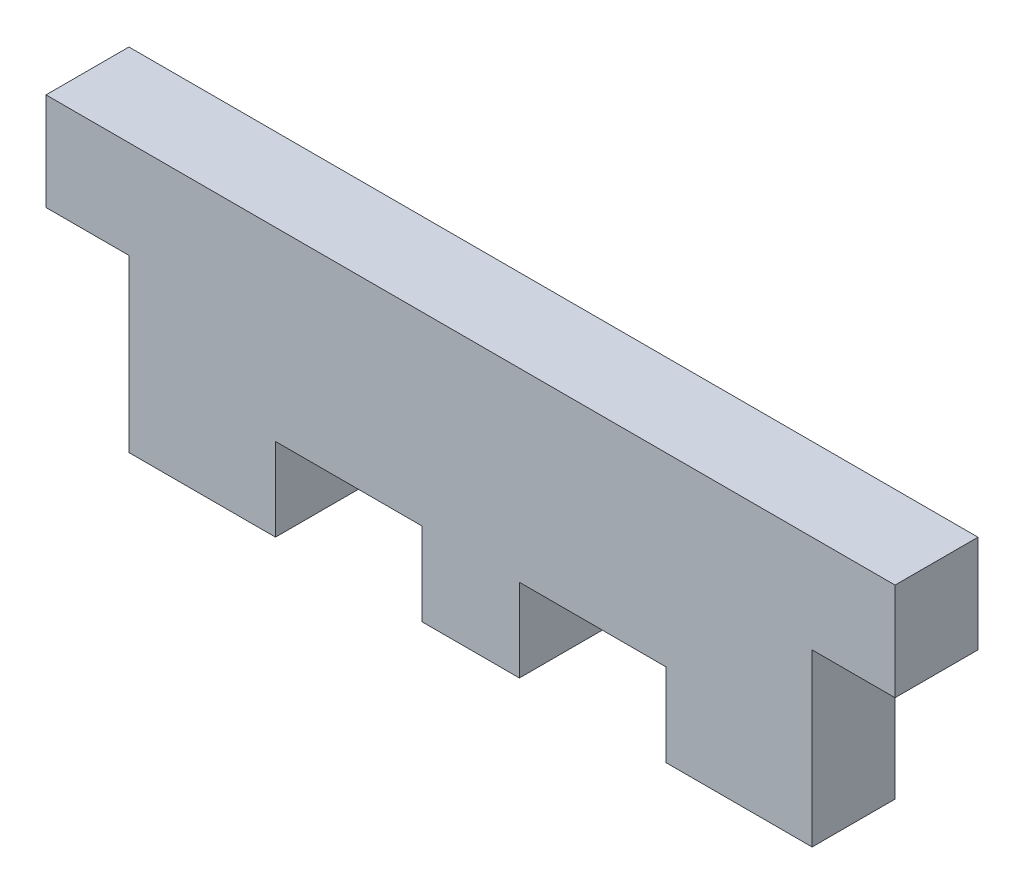
ISO-10303-21;
HEADER;
FILE_DESCRIPTION(('STEP AP214'),'2;1');
FILE_NAME('part.step','',(''),(''),'','','');
FILE_SCHEMA(('AUTOMOTIVE_DESIGN { 1 0 10303 214 1 1 1 1 }'));
ENDSEC;
DATA;
#1=APPLICATION_CONTEXT('core data for automotive mechanical design processes');
#2=APPLICATION_PROTOCOL_DEFINITION('international standard','automotive_design',2000,#1);
#3=PRODUCT_CONTEXT('',#1,'mechanical');
#4=PRODUCT('Part','Part','',(#3));
#5=PRODUCT_RELATED_PRODUCT_CATEGORY('part','',(#4));
#6=PRODUCT_DEFINITION_FORMATION('','',#4);
#7=PRODUCT_DEFINITION_CONTEXT('part definition',#1,'design');
#8=PRODUCT_DEFINITION('design','',#6,#7);
#9=PRODUCT_DEFINITION_SHAPE('','',#8);
#10=(LENGTH_UNIT() NAMED_UNIT(*) SI_UNIT(.MILLI.,.METRE.));
#11=(NAMED_UNIT(*) PLANE_ANGLE_UNIT() SI_UNIT($,.RADIAN.));
#12=(NAMED_UNIT(*) SI_UNIT($,.STERADIAN.) SOLID_ANGLE_UNIT());
#13=UNCERTAINTY_MEASURE_WITH_UNIT(LENGTH_MEASURE(1.E-05),#10,'distance_accuracy_value','');
#14=(GEOMETRIC_REPRESENTATION_CONTEXT(3) GLOBAL_UNCERTAINTY_ASSIGNED_CONTEXT((#13)) GLOBAL_UNIT_ASSIGNED_CONTEXT((#10,
#11,#12)) REPRESENTATION_CONTEXT('',''));
#15=CARTESIAN_POINT('',(0.,0.,0.));
#16=DIRECTION('',(0.,0.,1.));
#17=DIRECTION('',(1.,0.,0.));
#18=AXIS2_PLACEMENT_3D('',#15,#16,#17);
#19=CARTESIAN_POINT('',(-70.0392334774524,27.5,17.));
#20=DIRECTION('',(0.,-1.,0.));
#21=DIRECTION('',(0.,0.,-1.));
#22=AXIS2_PLACEMENT_3D('',#19,#20,#21);
#23=PLANE('',#22);
#24=DIRECTION('',(-1.,0.,0.));
#25=VECTOR('',#24,1.);
#26=CARTESIAN_POINT('',(-70.0392334774524,27.5,0.));
#27=LINE('',#26,#25);
#28=CARTESIAN_POINT('',(87.,27.5,0.));
#29=VERTEX_POINT('',#28);
#30=CARTESIAN_POINT('',(-87.0392334774524,27.5,0.));
#31=VERTEX_POINT('',#30);
#32=EDGE_CURVE('E112',#29,#31,#27,.T.);
#33=ORIENTED_EDGE('',*,*,#32,.T.);
#34=DIRECTION('',(0.,0.,-1.));
#35=VECTOR('',#34,1.);
#36=CARTESIAN_POINT('',(-87.0392334774524,27.5,17.));
#37=LINE('',#36,#35);
#38=CARTESIAN_POINT('',(-87.0392334774524,27.5,17.));
#39=VERTEX_POINT('',#38);
#40=EDGE_CURVE('E11',#39,#31,#37,.T.);
#41=ORIENTED_EDGE('',*,*,#40,.F.);
#42=DIRECTION('',(-1.,0.,0.));
#43=VECTOR('',#42,1.);
#44=CARTESIAN_POINT('',(70.,27.5,17.));
#45=LINE('',#44,#43);
#46=CARTESIAN_POINT('',(87.,27.5,17.));
#47=VERTEX_POINT('',#46);
#48=EDGE_CURVE('E118',#47,#39,#45,.T.);
#49=ORIENTED_EDGE('',*,*,#48,.F.);
#50=DIRECTION('',(0.,0.,-1.));
#51=VECTOR('',#50,1.);
#52=CARTESIAN_POINT('',(87.,27.5,17.));
#53=LINE('',#52,#51);
#54=EDGE_CURVE('E178',#47,#29,#53,.T.);
#55=ORIENTED_EDGE('',*,*,#54,.T.);
#56=EDGE_LOOP('',(#33,#41,#49,#55));
#57=FACE_BOUND('',#56,.T.);
#58=ADVANCED_FACE('F33',(#57),#23,.F.);
#59=CARTESIAN_POINT('',(-87.0392334774524,27.5,17.));
#60=DIRECTION('',(1.,0.,0.));
#61=DIRECTION('',(0.,0.,-1.));
#62=AXIS2_PLACEMENT_3D('',#59,#60,#61);
#63=PLANE('',#62);
#64=DIRECTION('',(0.,-1.,0.));
#65=VECTOR('',#64,1.);
#66=CARTESIAN_POINT('',(-87.0392334774524,27.5,0.));
#67=LINE('',#66,#65);
#68=CARTESIAN_POINT('',(-87.0392334774524,7.49999999999999,0.));
#69=VERTEX_POINT('',#68);
#70=EDGE_CURVE('E183',#31,#69,#67,.T.);
#71=ORIENTED_EDGE('',*,*,#70,.T.);
#72=DIRECTION('',(0.,0.,-1.));
#73=VECTOR('',#72,1.);
#74=CARTESIAN_POINT('',(-87.0392334774524,7.49999999999999,17.));
#75=LINE('',#74,#73);
#76=CARTESIAN_POINT('',(-87.0392334774524,7.49999999999999,17.));
#77=VERTEX_POINT('',#76);
#78=EDGE_CURVE('E41',#77,#69,#75,.T.);
#79=ORIENTED_EDGE('',*,*,#78,.F.);
#80=DIRECTION('',(0.,-1.,0.));
#81=VECTOR('',#80,1.);
#82=CARTESIAN_POINT('',(-87.0392334774524,27.5,17.));
#83=LINE('',#82,#81);
#84=EDGE_CURVE('E308',#39,#77,#83,.T.);
#85=ORIENTED_EDGE('',*,*,#84,.F.);
#86=ORIENTED_EDGE('',*,*,#40,.T.);
#87=EDGE_LOOP('',(#71,#79,#85,#86));
#88=FACE_BOUND('',#87,.T.);
#89=ADVANCED_FACE('F311',(#88),#63,.F.);
#90=CARTESIAN_POINT('',(-87.0392334774524,7.49999999999999,17.));
#91=DIRECTION('',(0.,1.,0.));
#92=DIRECTION('',(0.,0.,1.));
#93=AXIS2_PLACEMENT_3D('',#90,#91,#92);
#94=PLANE('',#93);
#95=DIRECTION('',(1.,0.,0.));
#96=VECTOR('',#95,1.);
#97=CARTESIAN_POINT('',(-87.0392334774524,7.49999999999999,0.));
#98=LINE('',#97,#96);
#99=CARTESIAN_POINT('',(-70.0392334774524,7.49999999999999,0.));
#100=VERTEX_POINT('',#99);
#101=EDGE_CURVE('E185',#69,#100,#98,.T.);
#102=ORIENTED_EDGE('',*,*,#101,.T.);
#103=DIRECTION('',(0.,0.,-1.));
#104=VECTOR('',#103,1.);
#105=CARTESIAN_POINT('',(-70.0392334774524,7.49999999999999,17.));
#106=LINE('',#105,#104);
#107=CARTESIAN_POINT('',(-70.0392334774524,7.49999999999999,17.));
#108=VERTEX_POINT('',#107);
#109=EDGE_CURVE('E248',#108,#100,#106,.T.);
#110=ORIENTED_EDGE('',*,*,#109,.F.);
#111=DIRECTION('',(1.,0.,0.));
#112=VECTOR('',#111,1.);
#113=CARTESIAN_POINT('',(-87.0392334774524,7.49999999999999,17.));
#114=LINE('',#113,#112);
#115=EDGE_CURVE('E257',#77,#108,#114,.T.);
#116=ORIENTED_EDGE('',*,*,#115,.F.);
#117=ORIENTED_EDGE('',*,*,#78,.T.);
#118=EDGE_LOOP('',(#102,#110,#116,#117));
#119=FACE_BOUND('',#118,.T.);
#120=ADVANCED_FACE('F255',(#119),#94,.F.);
#121=CARTESIAN_POINT('',(-70.0392334774524,7.49999999999999,17.));
#122=DIRECTION('',(1.,0.,0.));
#123=DIRECTION('',(0.,0.,-1.));
#124=AXIS2_PLACEMENT_3D('',#121,#122,#123);
#125=PLANE('',#124);
#126=DIRECTION('',(0.,-1.,0.));
#127=VECTOR('',#126,1.);
#128=CARTESIAN_POINT('',(-70.0392334774524,7.49999999999999,0.));
#129=LINE('',#128,#127);
#130=CARTESIAN_POINT('',(-70.0392334774524,-7.50000000000001,0.));
#131=VERTEX_POINT('',#130);
#132=EDGE_CURVE('E187',#100,#131,#129,.T.);
#133=ORIENTED_EDGE('',*,*,#132,.T.);
#134=DIRECTION('',(0.,0.,-1.));
#135=VECTOR('',#134,1.);
#136=CARTESIAN_POINT('',(-70.0392334774524,-7.50000000000001,17.));
#137=LINE('',#136,#135);
#138=CARTESIAN_POINT('',(-70.0392334774524,-7.50000000000001,17.));
#139=VERTEX_POINT('',#138);
#140=EDGE_CURVE('E245',#139,#131,#137,.T.);
#141=ORIENTED_EDGE('',*,*,#140,.F.);
#142=DIRECTION('',(0.,-1.,0.));
#143=VECTOR('',#142,1.);
#144=CARTESIAN_POINT('',(-70.0392334774524,7.49999999999999,17.));
#145=LINE('',#144,#143);
#146=EDGE_CURVE('E275',#108,#139,#145,.T.);
#147=ORIENTED_EDGE('',*,*,#146,.F.);
#148=ORIENTED_EDGE('',*,*,#109,.T.);
#149=EDGE_LOOP('',(#133,#141,#147,#148));
#150=FACE_BOUND('',#149,.T.);
#151=ADVANCED_FACE('F266',(#150),#125,.F.);
#152=CARTESIAN_POINT('',(-70.0392334774524,-7.50000000000001,17.));
#153=DIRECTION('',(0.999998075923362,0.00196167009820758,0.));
#154=DIRECTION('',(-0.00196167009820758,0.999998075923362,0.));
#155=AXIS2_PLACEMENT_3D('',#152,#153,#154);
#156=PLANE('',#155);
#157=DIRECTION('',(0.00196167009820758,-0.999998075923362,0.));
#158=VECTOR('',#157,1.);
#159=CARTESIAN_POINT('',(-70.0392334774524,-7.50000000000001,0.));
#160=LINE('',#159,#158);
#161=CARTESIAN_POINT('',(-70.,-27.5,0.));
#162=VERTEX_POINT('',#161);
#163=EDGE_CURVE('E189',#131,#162,#160,.T.);
#164=ORIENTED_EDGE('',*,*,#163,.T.);
#165=DIRECTION('',(0.,0.,-1.));
#166=VECTOR('',#165,1.);
#167=CARTESIAN_POINT('',(-70.,-27.5,17.));
#168=LINE('',#167,#166);
#169=CARTESIAN_POINT('',(-70.,-27.5,17.));
#170=VERTEX_POINT('',#169);
#171=EDGE_CURVE('E242',#170,#162,#168,.T.);
#172=ORIENTED_EDGE('',*,*,#171,.F.);
#173=DIRECTION('',(0.00196167009820758,-0.999998075923362,0.));
#174=VECTOR('',#173,1.);
#175=CARTESIAN_POINT('',(-70.0392334774524,-7.50000000000001,17.));
#176=LINE('',#175,#174);
#177=EDGE_CURVE('E272',#139,#170,#176,.T.);
#178=ORIENTED_EDGE('',*,*,#177,.F.);
#179=ORIENTED_EDGE('',*,*,#140,.T.);
#180=EDGE_LOOP('',(#164,#172,#178,#179));
#181=FACE_BOUND('',#180,.T.);
#182=ADVANCED_FACE('F270',(#181),#156,.F.);
#183=CARTESIAN_POINT('',(-70.,-27.5,17.));
#184=DIRECTION('',(0.,1.,0.));
#185=DIRECTION('',(0.,0.,1.));
#186=AXIS2_PLACEMENT_3D('',#183,#184,#185);
#187=PLANE('',#186);
#188=DIRECTION('',(1.,0.,0.));
#189=VECTOR('',#188,1.);
#190=CARTESIAN_POINT('',(-70.,-27.5,0.));
#191=LINE('',#190,#189);
#192=CARTESIAN_POINT('',(-40.,-27.5,0.));
#193=VERTEX_POINT('',#192);
#194=EDGE_CURVE('E191',#162,#193,#191,.T.);
#195=ORIENTED_EDGE('',*,*,#194,.T.);
#196=DIRECTION('',(0.,0.,-1.));
#197=VECTOR('',#196,1.);
#198=CARTESIAN_POINT('',(-40.,-27.5,17.));
#199=LINE('',#198,#197);
#200=CARTESIAN_POINT('',(-40.,-27.5,17.));
#201=VERTEX_POINT('',#200);
#202=EDGE_CURVE('E239',#201,#193,#199,.T.);
#203=ORIENTED_EDGE('',*,*,#202,.F.);
#204=DIRECTION('',(1.,0.,0.));
#205=VECTOR('',#204,1.);
#206=CARTESIAN_POINT('',(-70.,-27.5,17.));
#207=LINE('',#206,#205);
#208=EDGE_CURVE('E274',#170,#201,#207,.T.);
#209=ORIENTED_EDGE('',*,*,#208,.F.);
#210=ORIENTED_EDGE('',*,*,#171,.T.);
#211=EDGE_LOOP('',(#195,#203,#209,#210));
#212=FACE_BOUND('',#211,.T.);
#213=ADVANCED_FACE('F323',(#212),#187,.F.);
#214=CARTESIAN_POINT('',(-40.,-10.5,17.));
#215=DIRECTION('',(-1.,0.,0.));
#216=DIRECTION('',(0.,0.,1.));
#217=AXIS2_PLACEMENT_3D('',#214,#215,#216);
#218=PLANE('',#217);
#219=DIRECTION('',(0.,1.,0.));
#220=VECTOR('',#219,1.);
#221=CARTESIAN_POINT('',(-40.,-10.5,0.));
#222=LINE('',#221,#220);
#223=CARTESIAN_POINT('',(-40.,-10.5,0.));
#224=VERTEX_POINT('',#223);
#225=EDGE_CURVE('E193',#193,#224,#222,.T.);
#226=ORIENTED_EDGE('',*,*,#225,.T.);
#227=DIRECTION('',(0.,0.,-1.));
#228=VECTOR('',#227,1.);
#229=CARTESIAN_POINT('',(-40.,-10.5,17.));
#230=LINE('',#229,#228);
#231=CARTESIAN_POINT('',(-40.,-10.5,17.));
#232=VERTEX_POINT('',#231);
#233=EDGE_CURVE('E236',#232,#224,#230,.T.);
#234=ORIENTED_EDGE('',*,*,#233,.F.);
#235=DIRECTION('',(0.,1.,0.));
#236=VECTOR('',#235,1.);
#237=CARTESIAN_POINT('',(-40.,-10.5,17.));
#238=LINE('',#237,#236);
#239=EDGE_CURVE('E277',#201,#232,#238,.T.);
#240=ORIENTED_EDGE('',*,*,#239,.F.);
#241=ORIENTED_EDGE('',*,*,#202,.T.);
#242=EDGE_LOOP('',(#226,#234,#240,#241));
#243=FACE_BOUND('',#242,.T.);
#244=ADVANCED_FACE('F326',(#243),#218,.F.);
#245=CARTESIAN_POINT('',(-40.,-10.5,17.));
#246=DIRECTION('',(0.,1.,0.));
#247=DIRECTION('',(0.,0.,1.));
#248=AXIS2_PLACEMENT_3D('',#245,#246,#247);
#249=PLANE('',#248);
#250=DIRECTION('',(1.,0.,0.));
#251=VECTOR('',#250,1.);
#252=CARTESIAN_POINT('',(-40.,-10.5,0.));
#253=LINE('',#252,#251);
#254=CARTESIAN_POINT('',(-10.,-10.5,0.));
#255=VERTEX_POINT('',#254);
#256=EDGE_CURVE('E195',#224,#255,#253,.T.);
#257=ORIENTED_EDGE('',*,*,#256,.T.);
#258=DIRECTION('',(0.,0.,-1.));
#259=VECTOR('',#258,1.);
#260=CARTESIAN_POINT('',(-10.,-10.5,17.));
#261=LINE('',#260,#259);
#262=CARTESIAN_POINT('',(-10.,-10.5,17.));
#263=VERTEX_POINT('',#262);
#264=EDGE_CURVE('E233',#263,#255,#261,.T.);
#265=ORIENTED_EDGE('',*,*,#264,.F.);
#266=DIRECTION('',(1.,0.,0.));
#267=VECTOR('',#266,1.);
#268=CARTESIAN_POINT('',(-40.,-10.5,17.));
#269=LINE('',#268,#267);
#270=EDGE_CURVE('E283',#232,#263,#269,.T.);
#271=ORIENTED_EDGE('',*,*,#270,.F.);
#272=ORIENTED_EDGE('',*,*,#233,.T.);
#273=EDGE_LOOP('',(#257,#265,#271,#272));
#274=FACE_BOUND('',#273,.T.);
#275=ADVANCED_FACE('F330',(#274),#249,.F.);
#276=CARTESIAN_POINT('',(-10.,-10.5,17.));
#277=DIRECTION('',(1.,0.,0.));
#278=DIRECTION('',(0.,0.,-1.));
#279=AXIS2_PLACEMENT_3D('',#276,#277,#278);
#280=PLANE('',#279);
#281=DIRECTION('',(0.,-1.,0.));
#282=VECTOR('',#281,1.);
#283=CARTESIAN_POINT('',(-10.,-10.5,0.));
#284=LINE('',#283,#282);
#285=CARTESIAN_POINT('',(-10.,-27.5,0.));
#286=VERTEX_POINT('',#285);
#287=EDGE_CURVE('E197',#255,#286,#284,.T.);
#288=ORIENTED_EDGE('',*,*,#287,.T.);
#289=DIRECTION('',(0.,0.,-1.));
#290=VECTOR('',#289,1.);
#291=CARTESIAN_POINT('',(-10.,-27.5,17.));
#292=LINE('',#291,#290);
#293=CARTESIAN_POINT('',(-10.,-27.5,17.));
#294=VERTEX_POINT('',#293);
#295=EDGE_CURVE('E230',#294,#286,#292,.T.);
#296=ORIENTED_EDGE('',*,*,#295,.F.);
#297=DIRECTION('',(0.,-1.,0.));
#298=VECTOR('',#297,1.);
#299=CARTESIAN_POINT('',(-10.,-10.5,17.));
#300=LINE('',#299,#298);
#301=EDGE_CURVE('E285',#263,#294,#300,.T.);
#302=ORIENTED_EDGE('',*,*,#301,.F.);
#303=ORIENTED_EDGE('',*,*,#264,.T.);
#304=EDGE_LOOP('',(#288,#296,#302,#303));
#305=FACE_BOUND('',#304,.T.);
#306=ADVANCED_FACE('F334',(#305),#280,.F.);
#307=CARTESIAN_POINT('',(-10.,-27.5,17.));
#308=DIRECTION('',(0.,1.,0.));
#309=DIRECTION('',(0.,0.,1.));
#310=AXIS2_PLACEMENT_3D('',#307,#308,#309);
#311=PLANE('',#310);
#312=DIRECTION('',(1.,0.,0.));
#313=VECTOR('',#312,1.);
#314=CARTESIAN_POINT('',(-10.,-27.5,0.));
#315=LINE('',#314,#313);
#316=CARTESIAN_POINT('',(9.99999999999999,-27.5,0.));
#317=VERTEX_POINT('',#316);
#318=EDGE_CURVE('E199',#286,#317,#315,.T.);
#319=ORIENTED_EDGE('',*,*,#318,.T.);
#320=DIRECTION('',(0.,0.,-1.));
#321=VECTOR('',#320,1.);
#322=CARTESIAN_POINT('',(9.99999999999999,-27.5,17.));
#323=LINE('',#322,#321);
#324=CARTESIAN_POINT('',(9.99999999999999,-27.5,17.));
#325=VERTEX_POINT('',#324);
#326=EDGE_CURVE('E227',#325,#317,#323,.T.);
#327=ORIENTED_EDGE('',*,*,#326,.F.);
#328=DIRECTION('',(1.,0.,0.));
#329=VECTOR('',#328,1.);
#330=CARTESIAN_POINT('',(-10.,-27.5,17.));
#331=LINE('',#330,#329);
#332=EDGE_CURVE('E287',#294,#325,#331,.T.);
#333=ORIENTED_EDGE('',*,*,#332,.F.);
#334=ORIENTED_EDGE('',*,*,#295,.T.);
#335=EDGE_LOOP('',(#319,#327,#333,#334));
#336=FACE_BOUND('',#335,.T.);
#337=ADVANCED_FACE('F338',(#336),#311,.F.);
#338=CARTESIAN_POINT('',(9.99999999999999,-10.5,17.));
#339=DIRECTION('',(-1.,0.,0.));
#340=DIRECTION('',(0.,-1.,0.));
#341=AXIS2_PLACEMENT_3D('',#338,#339,#340);
#342=PLANE('',#341);
#343=DIRECTION('',(0.,1.,0.));
#344=VECTOR('',#343,1.);
#345=CARTESIAN_POINT('',(9.99999999999999,-10.5,0.));
#346=LINE('',#345,#344);
#347=CARTESIAN_POINT('',(9.99999999999999,-10.5,0.));
#348=VERTEX_POINT('',#347);
#349=EDGE_CURVE('E201',#317,#348,#346,.T.);
#350=ORIENTED_EDGE('',*,*,#349,.T.);
#351=DIRECTION('',(0.,0.,-1.));
#352=VECTOR('',#351,1.);
#353=CARTESIAN_POINT('',(9.99999999999999,-10.5,17.));
#354=LINE('',#353,#352);
#355=CARTESIAN_POINT('',(9.99999999999999,-10.5,17.));
#356=VERTEX_POINT('',#355);
#357=EDGE_CURVE('E224',#356,#348,#354,.T.);
#358=ORIENTED_EDGE('',*,*,#357,.F.);
#359=DIRECTION('',(0.,1.,0.));
#360=VECTOR('',#359,1.);
#361=CARTESIAN_POINT('',(9.99999999999999,-10.5,17.));
#362=LINE('',#361,#360);
#363=EDGE_CURVE('E289',#325,#356,#362,.T.);
#364=ORIENTED_EDGE('',*,*,#363,.F.);
#365=ORIENTED_EDGE('',*,*,#326,.T.);
#366=EDGE_LOOP('',(#350,#358,#364,#365));
#367=FACE_BOUND('',#366,.T.);
#368=ADVANCED_FACE('F342',(#367),#342,.F.);
#369=CARTESIAN_POINT('',(9.99999999999999,-10.5,17.));
#370=DIRECTION('',(0.,1.,0.));
#371=DIRECTION('',(0.,0.,1.));
#372=AXIS2_PLACEMENT_3D('',#369,#370,#371);
#373=PLANE('',#372);
#374=DIRECTION('',(1.,0.,0.));
#375=VECTOR('',#374,1.);
#376=CARTESIAN_POINT('',(9.99999999999999,-10.5,0.));
#377=LINE('',#376,#375);
#378=CARTESIAN_POINT('',(40.,-10.5,0.));
#379=VERTEX_POINT('',#378);
#380=EDGE_CURVE('E203',#348,#379,#377,.T.);
#381=ORIENTED_EDGE('',*,*,#380,.T.);
#382=DIRECTION('',(0.,0.,-1.));
#383=VECTOR('',#382,1.);
#384=CARTESIAN_POINT('',(40.,-10.5,17.));
#385=LINE('',#384,#383);
#386=CARTESIAN_POINT('',(40.,-10.5,17.));
#387=VERTEX_POINT('',#386);
#388=EDGE_CURVE('E221',#387,#379,#385,.T.);
#389=ORIENTED_EDGE('',*,*,#388,.F.);
#390=DIRECTION('',(1.,0.,0.));
#391=VECTOR('',#390,1.);
#392=CARTESIAN_POINT('',(9.99999999999999,-10.5,17.));
#393=LINE('',#392,#391);
#394=EDGE_CURVE('E291',#356,#387,#393,.T.);
#395=ORIENTED_EDGE('',*,*,#394,.F.);
#396=ORIENTED_EDGE('',*,*,#357,.T.);
#397=EDGE_LOOP('',(#381,#389,#395,#396));
#398=FACE_BOUND('',#397,.T.);
#399=ADVANCED_FACE('F346',(#398),#373,.F.);
#400=CARTESIAN_POINT('',(40.,-10.5,17.));
#401=DIRECTION('',(1.,0.,0.));
#402=DIRECTION('',(0.,0.,-1.));
#403=AXIS2_PLACEMENT_3D('',#400,#401,#402);
#404=PLANE('',#403);
#405=DIRECTION('',(0.,-1.,0.));
#406=VECTOR('',#405,1.);
#407=CARTESIAN_POINT('',(40.,-10.5,0.));
#408=LINE('',#407,#406);
#409=CARTESIAN_POINT('',(40.,-27.5,0.));
#410=VERTEX_POINT('',#409);
#411=EDGE_CURVE('E205',#379,#410,#408,.T.);
#412=ORIENTED_EDGE('',*,*,#411,.T.);
#413=DIRECTION('',(0.,0.,-1.));
#414=VECTOR('',#413,1.);
#415=CARTESIAN_POINT('',(40.,-27.5,17.));
#416=LINE('',#415,#414);
#417=CARTESIAN_POINT('',(40.,-27.5,17.));
#418=VERTEX_POINT('',#417);
#419=EDGE_CURVE('E218',#418,#410,#416,.T.);
#420=ORIENTED_EDGE('',*,*,#419,.F.);
#421=DIRECTION('',(0.,-1.,0.));
#422=VECTOR('',#421,1.);
#423=CARTESIAN_POINT('',(40.,-10.5,17.));
#424=LINE('',#423,#422);
#425=EDGE_CURVE('E293',#387,#418,#424,.T.);
#426=ORIENTED_EDGE('',*,*,#425,.F.);
#427=ORIENTED_EDGE('',*,*,#388,.T.);
#428=EDGE_LOOP('',(#412,#420,#426,#427));
#429=FACE_BOUND('',#428,.T.);
#430=ADVANCED_FACE('F299',(#429),#404,.F.);
#431=CARTESIAN_POINT('',(40.,-27.5,17.));
#432=DIRECTION('',(0.,1.,0.));
#433=DIRECTION('',(0.,0.,1.));
#434=AXIS2_PLACEMENT_3D('',#431,#432,#433);
#435=PLANE('',#434);
#436=DIRECTION('',(1.,0.,0.));
#437=VECTOR('',#436,1.);
#438=CARTESIAN_POINT('',(40.,-27.5,0.));
#439=LINE('',#438,#437);
#440=CARTESIAN_POINT('',(70.,-27.5,0.));
#441=VERTEX_POINT('',#440);
#442=EDGE_CURVE('E207',#410,#441,#439,.T.);
#443=ORIENTED_EDGE('',*,*,#442,.T.);
#444=DIRECTION('',(0.,0.,-1.));
#445=VECTOR('',#444,1.);
#446=CARTESIAN_POINT('',(70.,-27.5,17.));
#447=LINE('',#446,#445);
#448=CARTESIAN_POINT('',(70.,-27.5,17.));
#449=VERTEX_POINT('',#448);
#450=EDGE_CURVE('E173',#449,#441,#447,.T.);
#451=ORIENTED_EDGE('',*,*,#450,.F.);
#452=DIRECTION('',(1.,0.,0.));
#453=VECTOR('',#452,1.);
#454=CARTESIAN_POINT('',(40.,-27.5,17.));
#455=LINE('',#454,#453);
#456=EDGE_CURVE('E165',#418,#449,#455,.T.);
#457=ORIENTED_EDGE('',*,*,#456,.F.);
#458=ORIENTED_EDGE('',*,*,#419,.T.);
#459=EDGE_LOOP('',(#443,#451,#457,#458));
#460=FACE_BOUND('',#459,.T.);
#461=ADVANCED_FACE('F303',(#460),#435,.F.);
#462=CARTESIAN_POINT('',(70.,7.49999999999999,17.));
#463=DIRECTION('',(-1.,0.,0.));
#464=DIRECTION('',(0.,0.,1.));
#465=AXIS2_PLACEMENT_3D('',#462,#463,#464);
#466=PLANE('',#465);
#467=DIRECTION('',(0.,1.,0.));
#468=VECTOR('',#467,1.);
#469=CARTESIAN_POINT('',(70.,7.49999999999999,0.));
#470=LINE('',#469,#468);
#471=CARTESIAN_POINT('',(70.,7.49999999999999,0.));
#472=VERTEX_POINT('',#471);
#473=EDGE_CURVE('E172',#441,#472,#470,.T.);
#474=ORIENTED_EDGE('',*,*,#473,.T.);
#475=DIRECTION('',(0.,0.,-1.));
#476=VECTOR('',#475,1.);
#477=CARTESIAN_POINT('',(70.,7.49999999999999,17.));
#478=LINE('',#477,#476);
#479=CARTESIAN_POINT('',(70.,7.49999999999999,17.));
#480=VERTEX_POINT('',#479);
#481=EDGE_CURVE('E170',#480,#472,#478,.T.);
#482=ORIENTED_EDGE('',*,*,#481,.F.);
#483=DIRECTION('',(0.,1.,0.));
#484=VECTOR('',#483,1.);
#485=CARTESIAN_POINT('',(70.,-7.50000000000001,17.));
#486=LINE('',#485,#484);
#487=EDGE_CURVE('E159',#449,#480,#486,.T.);
#488=ORIENTED_EDGE('',*,*,#487,.F.);
#489=ORIENTED_EDGE('',*,*,#450,.T.);
#490=EDGE_LOOP('',(#474,#482,#488,#489));
#491=FACE_BOUND('',#490,.T.);
#492=ADVANCED_FACE('F171',(#491),#466,.F.);
#493=CARTESIAN_POINT('',(87.,7.49999999999999,17.));
#494=DIRECTION('',(0.,1.,0.));
#495=DIRECTION('',(0.,0.,1.));
#496=AXIS2_PLACEMENT_3D('',#493,#494,#495);
#497=PLANE('',#496);
#498=DIRECTION('',(1.,0.,0.));
#499=VECTOR('',#498,1.);
#500=CARTESIAN_POINT('',(87.,7.49999999999999,0.));
#501=LINE('',#500,#499);
#502=CARTESIAN_POINT('',(87.,7.49999999999999,0.));
#503=VERTEX_POINT('',#502);
#504=EDGE_CURVE('E105',#472,#503,#501,.T.);
#505=ORIENTED_EDGE('',*,*,#504,.T.);
#506=DIRECTION('',(0.,0.,-1.));
#507=VECTOR('',#506,1.);
#508=CARTESIAN_POINT('',(87.,7.49999999999999,17.));
#509=LINE('',#508,#507);
#510=CARTESIAN_POINT('',(87.,7.49999999999999,17.));
#511=VERTEX_POINT('',#510);
#512=EDGE_CURVE('E174',#511,#503,#509,.T.);
#513=ORIENTED_EDGE('',*,*,#512,.F.);
#514=DIRECTION('',(1.,0.,0.));
#515=VECTOR('',#514,1.);
#516=CARTESIAN_POINT('',(87.,7.49999999999999,17.));
#517=LINE('',#516,#515);
#518=EDGE_CURVE('E163',#480,#511,#517,.T.);
#519=ORIENTED_EDGE('',*,*,#518,.F.);
#520=ORIENTED_EDGE('',*,*,#481,.T.);
#521=EDGE_LOOP('',(#505,#513,#519,#520));
#522=FACE_BOUND('',#521,.T.);
#523=ADVANCED_FACE('F176',(#522),#497,.F.);
#524=CARTESIAN_POINT('',(87.,27.5,17.));
#525=DIRECTION('',(-1.,0.,0.));
#526=DIRECTION('',(0.,0.,1.));
#527=AXIS2_PLACEMENT_3D('',#524,#525,#526);
#528=PLANE('',#527);
#529=DIRECTION('',(0.,1.,0.));
#530=VECTOR('',#529,1.);
#531=CARTESIAN_POINT('',(87.,27.5,0.));
#532=LINE('',#531,#530);
#533=EDGE_CURVE('E212',#503,#29,#532,.T.);
#534=ORIENTED_EDGE('',*,*,#533,.T.);
#535=ORIENTED_EDGE('',*,*,#54,.F.);
#536=DIRECTION('',(0.,1.,0.));
#537=VECTOR('',#536,1.);
#538=CARTESIAN_POINT('',(87.,27.5,17.));
#539=LINE('',#538,#537);
#540=EDGE_CURVE('E49',#511,#47,#539,.T.);
#541=ORIENTED_EDGE('',*,*,#540,.F.);
#542=ORIENTED_EDGE('',*,*,#512,.T.);
#543=EDGE_LOOP('',(#534,#535,#541,#542));
#544=FACE_BOUND('',#543,.T.);
#545=ADVANCED_FACE('F306',(#544),#528,.F.);
#546=CARTESIAN_POINT('',(0.,0.,17.));
#547=DIRECTION('',(0.,0.,-1.));
#548=DIRECTION('',(-1.,0.,0.));
#549=AXIS2_PLACEMENT_3D('',#546,#547,#548);
#550=PLANE('',#549);
#551=ORIENTED_EDGE('',*,*,#48,.T.);
#552=ORIENTED_EDGE('',*,*,#84,.T.);
#553=ORIENTED_EDGE('',*,*,#115,.T.);
#554=ORIENTED_EDGE('',*,*,#146,.T.);
#555=ORIENTED_EDGE('',*,*,#177,.T.);
#556=ORIENTED_EDGE('',*,*,#208,.T.);
#557=ORIENTED_EDGE('',*,*,#239,.T.);
#558=ORIENTED_EDGE('',*,*,#270,.T.);
#559=ORIENTED_EDGE('',*,*,#301,.T.);
#560=ORIENTED_EDGE('',*,*,#332,.T.);
#561=ORIENTED_EDGE('',*,*,#363,.T.);
#562=ORIENTED_EDGE('',*,*,#394,.T.);
#563=ORIENTED_EDGE('',*,*,#425,.T.);
#564=ORIENTED_EDGE('',*,*,#456,.T.);
#565=ORIENTED_EDGE('',*,*,#487,.T.);
#566=ORIENTED_EDGE('',*,*,#518,.T.);
#567=ORIENTED_EDGE('',*,*,#540,.T.);
#568=EDGE_LOOP('',(#551,#552,#553,#554,#555,#556,#557,#558,#559,#560,#561,#562,#563,#564,#565,
#566,#567));
#569=FACE_BOUND('',#568,.T.);
#570=ADVANCED_FACE('F161',(#569),#550,.F.);
#571=CARTESIAN_POINT('',(0.,0.,0.));
#572=DIRECTION('',(0.,0.,-1.));
#573=DIRECTION('',(-1.,0.,0.));
#574=AXIS2_PLACEMENT_3D('',#571,#572,#573);
#575=PLANE('',#574);
#576=ORIENTED_EDGE('',*,*,#32,.F.);
#577=ORIENTED_EDGE('',*,*,#533,.F.);
#578=ORIENTED_EDGE('',*,*,#504,.F.);
#579=ORIENTED_EDGE('',*,*,#473,.F.);
#580=ORIENTED_EDGE('',*,*,#442,.F.);
#581=ORIENTED_EDGE('',*,*,#411,.F.);
#582=ORIENTED_EDGE('',*,*,#380,.F.);
#583=ORIENTED_EDGE('',*,*,#349,.F.);
#584=ORIENTED_EDGE('',*,*,#318,.F.);
#585=ORIENTED_EDGE('',*,*,#287,.F.);
#586=ORIENTED_EDGE('',*,*,#256,.F.);
#587=ORIENTED_EDGE('',*,*,#225,.F.);
#588=ORIENTED_EDGE('',*,*,#194,.F.);
#589=ORIENTED_EDGE('',*,*,#163,.F.);
#590=ORIENTED_EDGE('',*,*,#132,.F.);
#591=ORIENTED_EDGE('',*,*,#101,.F.);
#592=ORIENTED_EDGE('',*,*,#70,.F.);
#593=EDGE_LOOP('',(#576,#577,#578,#579,#580,#581,#582,#583,#584,#585,#586,#587,#588,#589,#590,
#591,#592));
#594=FACE_BOUND('',#593,.T.);
#595=ADVANCED_FACE('F261',(#594),#575,.T.);
#596=CLOSED_SHELL('',(#58,#89,#120,#151,#182,#213,#244,#275,#306,#337,#368,#399,#430,#461,#492,
#523,#545,#570,#595));
#597=MANIFOLD_SOLID_BREP('B2',#596);
#598=ADVANCED_BREP_SHAPE_REPRESENTATION('',(#18,#597),#14);
#599=SHAPE_DEFINITION_REPRESENTATION(#9,#598);
ENDSEC;
END-ISO-10303-21;
